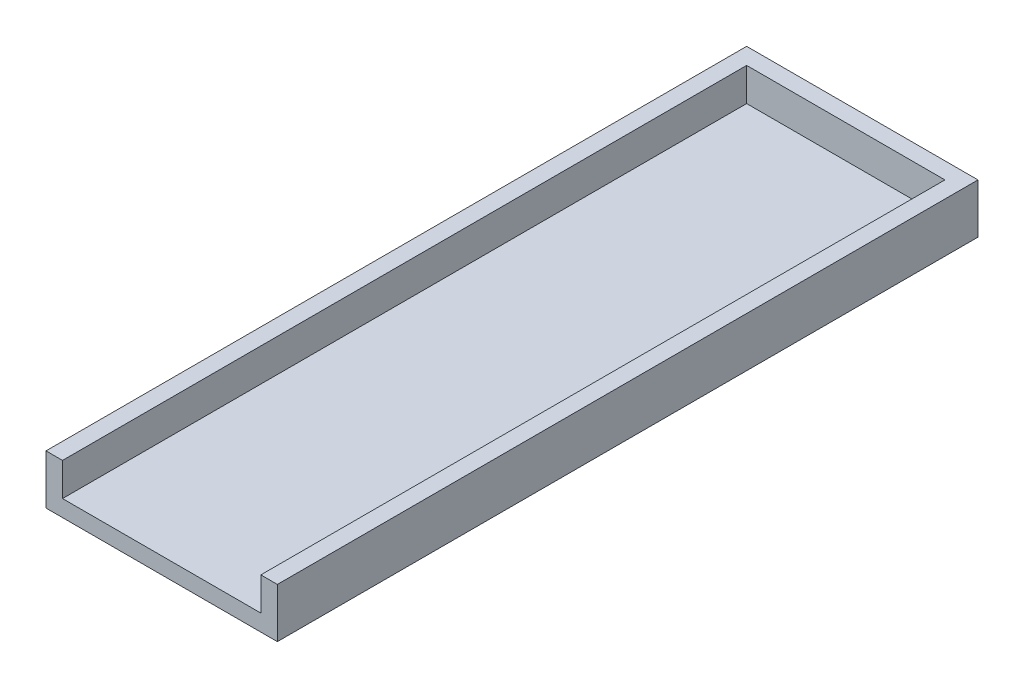
ISO-10303-21;
HEADER;
FILE_DESCRIPTION(('STEP AP214'),'2;1');
FILE_NAME('part.step','',(''),(''),'','','');
FILE_SCHEMA(('AUTOMOTIVE_DESIGN { 1 0 10303 214 1 1 1 1 }'));
ENDSEC;
DATA;
#1=APPLICATION_CONTEXT('core data for automotive mechanical design processes');
#2=APPLICATION_PROTOCOL_DEFINITION('international standard','automotive_design',2000,#1);
#3=PRODUCT_CONTEXT('',#1,'mechanical');
#4=PRODUCT('Part','Part','',(#3));
#5=PRODUCT_RELATED_PRODUCT_CATEGORY('part','',(#4));
#6=PRODUCT_DEFINITION_FORMATION('','',#4);
#7=PRODUCT_DEFINITION_CONTEXT('part definition',#1,'design');
#8=PRODUCT_DEFINITION('design','',#6,#7);
#9=PRODUCT_DEFINITION_SHAPE('','',#8);
#10=(LENGTH_UNIT() NAMED_UNIT(*) SI_UNIT(.MILLI.,.METRE.));
#11=(NAMED_UNIT(*) PLANE_ANGLE_UNIT() SI_UNIT($,.RADIAN.));
#12=(NAMED_UNIT(*) SI_UNIT($,.STERADIAN.) SOLID_ANGLE_UNIT());
#13=UNCERTAINTY_MEASURE_WITH_UNIT(LENGTH_MEASURE(1.E-05),#10,'distance_accuracy_value','');
#14=(GEOMETRIC_REPRESENTATION_CONTEXT(3) GLOBAL_UNCERTAINTY_ASSIGNED_CONTEXT((#13)) GLOBAL_UNIT_ASSIGNED_CONTEXT((#10,
#11,#12)) REPRESENTATION_CONTEXT('',''));
#15=CARTESIAN_POINT('',(0.,0.,0.));
#16=DIRECTION('',(0.,0.,1.));
#17=DIRECTION('',(1.,0.,0.));
#18=AXIS2_PLACEMENT_3D('',#15,#16,#17);
#19=CARTESIAN_POINT('',(177.8,76.2,538.48));
#20=DIRECTION('',(-1.,0.,0.));
#21=DIRECTION('',(0.,0.,1.));
#22=AXIS2_PLACEMENT_3D('',#19,#20,#21);
#23=PLANE('',#22);
#24=DIRECTION('',(0.,0.,-1.));
#25=VECTOR('',#24,1.);
#26=CARTESIAN_POINT('',(177.8,0.,538.48));
#27=LINE('',#26,#25);
#28=CARTESIAN_POINT('',(177.8,0.,538.48));
#29=VERTEX_POINT('',#28);
#30=CARTESIAN_POINT('',(177.8,0.,-538.48));
#31=VERTEX_POINT('',#30);
#32=EDGE_CURVE('E162',#29,#31,#27,.T.);
#33=ORIENTED_EDGE('',*,*,#32,.T.);
#34=DIRECTION('',(0.,-1.,0.));
#35=VECTOR('',#34,1.);
#36=CARTESIAN_POINT('',(177.8,76.2,-538.48));
#37=LINE('',#36,#35);
#38=CARTESIAN_POINT('',(177.8,76.2,-538.48));
#39=VERTEX_POINT('',#38);
#40=EDGE_CURVE('E11',#39,#31,#37,.T.);
#41=ORIENTED_EDGE('',*,*,#40,.F.);
#42=DIRECTION('',(0.,0.,-1.));
#43=VECTOR('',#42,1.);
#44=CARTESIAN_POINT('',(177.8,76.2,538.48));
#45=LINE('',#44,#43);
#46=CARTESIAN_POINT('',(177.8,76.2,538.48));
#47=VERTEX_POINT('',#46);
#48=EDGE_CURVE('E168',#47,#39,#45,.T.);
#49=ORIENTED_EDGE('',*,*,#48,.F.);
#50=DIRECTION('',(0.,-1.,0.));
#51=VECTOR('',#50,1.);
#52=CARTESIAN_POINT('',(177.8,76.2,538.48));
#53=LINE('',#52,#51);
#54=EDGE_CURVE('E179',#47,#29,#53,.T.);
#55=ORIENTED_EDGE('',*,*,#54,.T.);
#56=EDGE_LOOP('',(#33,#41,#49,#55));
#57=FACE_BOUND('',#56,.T.);
#58=ADVANCED_FACE('F45',(#57),#23,.F.);
#59=CARTESIAN_POINT('',(-177.8,76.2,-538.48));
#60=DIRECTION('',(0.,0.,1.));
#61=DIRECTION('',(1.,0.,0.));
#62=AXIS2_PLACEMENT_3D('',#59,#60,#61);
#63=PLANE('',#62);
#64=DIRECTION('',(-1.,0.,0.));
#65=VECTOR('',#64,1.);
#66=CARTESIAN_POINT('',(-177.8,0.,-538.48));
#67=LINE('',#66,#65);
#68=CARTESIAN_POINT('',(-177.8,0.,-538.48));
#69=VERTEX_POINT('',#68);
#70=EDGE_CURVE('E183',#31,#69,#67,.T.);
#71=ORIENTED_EDGE('',*,*,#70,.T.);
#72=DIRECTION('',(0.,-1.,0.));
#73=VECTOR('',#72,1.);
#74=CARTESIAN_POINT('',(-177.8,76.2,-538.48));
#75=LINE('',#74,#73);
#76=CARTESIAN_POINT('',(-177.8,76.2,-538.48));
#77=VERTEX_POINT('',#76);
#78=EDGE_CURVE('E53',#77,#69,#75,.T.);
#79=ORIENTED_EDGE('',*,*,#78,.F.);
#80=DIRECTION('',(-1.,0.,0.));
#81=VECTOR('',#80,1.);
#82=CARTESIAN_POINT('',(-177.8,76.2,-538.48));
#83=LINE('',#82,#81);
#84=EDGE_CURVE('E97',#39,#77,#83,.T.);
#85=ORIENTED_EDGE('',*,*,#84,.F.);
#86=ORIENTED_EDGE('',*,*,#40,.T.);
#87=EDGE_LOOP('',(#71,#79,#85,#86));
#88=FACE_BOUND('',#87,.T.);
#89=ADVANCED_FACE('F224',(#88),#63,.F.);
#90=CARTESIAN_POINT('',(-177.8,76.2,538.48));
#91=DIRECTION('',(1.,0.,0.));
#92=DIRECTION('',(0.,0.,-1.));
#93=AXIS2_PLACEMENT_3D('',#90,#91,#92);
#94=PLANE('',#93);
#95=DIRECTION('',(0.,0.,1.));
#96=VECTOR('',#95,1.);
#97=CARTESIAN_POINT('',(-177.8,0.,538.48));
#98=LINE('',#97,#96);
#99=CARTESIAN_POINT('',(-177.8,0.,538.48));
#100=VERTEX_POINT('',#99);
#101=EDGE_CURVE('E186',#69,#100,#98,.T.);
#102=ORIENTED_EDGE('',*,*,#101,.T.);
#103=DIRECTION('',(0.,-1.,0.));
#104=VECTOR('',#103,1.);
#105=CARTESIAN_POINT('',(-177.8,76.2,538.48));
#106=LINE('',#105,#104);
#107=CARTESIAN_POINT('',(-177.8,76.2,538.48));
#108=VERTEX_POINT('',#107);
#109=EDGE_CURVE('E193',#108,#100,#106,.T.);
#110=ORIENTED_EDGE('',*,*,#109,.F.);
#111=DIRECTION('',(0.,0.,1.));
#112=VECTOR('',#111,1.);
#113=CARTESIAN_POINT('',(-177.8,76.2,538.48));
#114=LINE('',#113,#112);
#115=EDGE_CURVE('E173',#77,#108,#114,.T.);
#116=ORIENTED_EDGE('',*,*,#115,.F.);
#117=ORIENTED_EDGE('',*,*,#78,.T.);
#118=EDGE_LOOP('',(#102,#110,#116,#117));
#119=FACE_BOUND('',#118,.T.);
#120=ADVANCED_FACE('F200',(#119),#94,.F.);
#121=CARTESIAN_POINT('',(-177.8,76.2,538.48));
#122=DIRECTION('',(0.,0.,-1.));
#123=DIRECTION('',(-1.,0.,0.));
#124=AXIS2_PLACEMENT_3D('',#121,#122,#123);
#125=PLANE('',#124);
#126=DIRECTION('',(1.,0.,0.));
#127=VECTOR('',#126,1.);
#128=CARTESIAN_POINT('',(-152.4,25.4,538.48));
#129=LINE('',#128,#127);
#130=CARTESIAN_POINT('',(-152.4,25.4,538.48));
#131=VERTEX_POINT('',#130);
#132=CARTESIAN_POINT('',(152.4,25.4,538.48));
#133=VERTEX_POINT('',#132);
#134=EDGE_CURVE('E137',#131,#133,#129,.T.);
#135=ORIENTED_EDGE('',*,*,#134,.F.);
#136=DIRECTION('',(0.,1.,0.));
#137=VECTOR('',#136,1.);
#138=CARTESIAN_POINT('',(-152.4,25.4,538.48));
#139=LINE('',#138,#137);
#140=CARTESIAN_POINT('',(-152.4,76.2,538.48));
#141=VERTEX_POINT('',#140);
#142=EDGE_CURVE('E120',#131,#141,#139,.T.);
#143=ORIENTED_EDGE('',*,*,#142,.T.);
#144=DIRECTION('',(1.,0.,0.));
#145=VECTOR('',#144,1.);
#146=CARTESIAN_POINT('',(-177.8,76.2,538.48));
#147=LINE('',#146,#145);
#148=EDGE_CURVE('E176',#108,#141,#147,.T.);
#149=ORIENTED_EDGE('',*,*,#148,.F.);
#150=ORIENTED_EDGE('',*,*,#109,.T.);
#151=DIRECTION('',(1.,0.,0.));
#152=VECTOR('',#151,1.);
#153=CARTESIAN_POINT('',(-177.8,0.,538.48));
#154=LINE('',#153,#152);
#155=EDGE_CURVE('E90',#100,#29,#154,.T.);
#156=ORIENTED_EDGE('',*,*,#155,.T.);
#157=ORIENTED_EDGE('',*,*,#54,.F.);
#158=CARTESIAN_POINT('',(152.4,76.2,538.48));
#159=VERTEX_POINT('',#158);
#160=EDGE_CURVE('E68',#159,#47,#147,.T.);
#161=ORIENTED_EDGE('',*,*,#160,.F.);
#162=DIRECTION('',(0.,1.,0.));
#163=VECTOR('',#162,1.);
#164=CARTESIAN_POINT('',(152.4,25.4,538.48));
#165=LINE('',#164,#163);
#166=EDGE_CURVE('E60',#133,#159,#165,.T.);
#167=ORIENTED_EDGE('',*,*,#166,.F.);
#168=EDGE_LOOP('',(#135,#143,#149,#150,#156,#157,#161,#167));
#169=FACE_BOUND('',#168,.T.);
#170=ADVANCED_FACE('F142',(#169),#125,.F.);
#171=CARTESIAN_POINT('',(0.,76.2,0.));
#172=DIRECTION('',(0.,-1.,0.));
#173=DIRECTION('',(0.,0.,-1.));
#174=AXIS2_PLACEMENT_3D('',#171,#172,#173);
#175=PLANE('',#174);
#176=ORIENTED_EDGE('',*,*,#148,.T.);
#177=DIRECTION('',(0.,0.,1.));
#178=VECTOR('',#177,1.);
#179=CARTESIAN_POINT('',(-152.4,76.2,538.48));
#180=LINE('',#179,#178);
#181=CARTESIAN_POINT('',(-152.4,76.2,-513.08));
#182=VERTEX_POINT('',#181);
#183=EDGE_CURVE('E126',#182,#141,#180,.T.);
#184=ORIENTED_EDGE('',*,*,#183,.F.);
#185=DIRECTION('',(-1.,0.,0.));
#186=VECTOR('',#185,1.);
#187=CARTESIAN_POINT('',(-152.4,76.2,-513.08));
#188=LINE('',#187,#186);
#189=CARTESIAN_POINT('',(152.4,76.2,-513.08));
#190=VERTEX_POINT('',#189);
#191=EDGE_CURVE('E140',#190,#182,#188,.T.);
#192=ORIENTED_EDGE('',*,*,#191,.F.);
#193=DIRECTION('',(0.,0.,-1.));
#194=VECTOR('',#193,1.);
#195=CARTESIAN_POINT('',(152.4,76.2,538.48));
#196=LINE('',#195,#194);
#197=EDGE_CURVE('E153',#159,#190,#196,.T.);
#198=ORIENTED_EDGE('',*,*,#197,.F.);
#199=ORIENTED_EDGE('',*,*,#160,.T.);
#200=ORIENTED_EDGE('',*,*,#48,.T.);
#201=ORIENTED_EDGE('',*,*,#84,.T.);
#202=ORIENTED_EDGE('',*,*,#115,.T.);
#203=EDGE_LOOP('',(#176,#184,#192,#198,#199,#200,#201,#202));
#204=FACE_BOUND('',#203,.T.);
#205=ADVANCED_FACE('F209',(#204),#175,.F.);
#206=CARTESIAN_POINT('',(0.,0.,0.));
#207=DIRECTION('',(0.,-1.,0.));
#208=DIRECTION('',(0.,0.,-1.));
#209=AXIS2_PLACEMENT_3D('',#206,#207,#208);
#210=PLANE('',#209);
#211=ORIENTED_EDGE('',*,*,#32,.F.);
#212=ORIENTED_EDGE('',*,*,#155,.F.);
#213=ORIENTED_EDGE('',*,*,#101,.F.);
#214=ORIENTED_EDGE('',*,*,#70,.F.);
#215=EDGE_LOOP('',(#211,#212,#213,#214));
#216=FACE_BOUND('',#215,.T.);
#217=ADVANCED_FACE('F204',(#216),#210,.T.);
#218=CARTESIAN_POINT('',(-152.4,25.4,538.48));
#219=DIRECTION('',(-1.,0.,0.));
#220=DIRECTION('',(0.,0.,1.));
#221=AXIS2_PLACEMENT_3D('',#218,#219,#220);
#222=PLANE('',#221);
#223=ORIENTED_EDGE('',*,*,#183,.T.);
#224=ORIENTED_EDGE('',*,*,#142,.F.);
#225=DIRECTION('',(0.,0.,1.));
#226=VECTOR('',#225,1.);
#227=CARTESIAN_POINT('',(-152.4,25.4,538.48));
#228=LINE('',#227,#226);
#229=CARTESIAN_POINT('',(-152.4,25.4,-513.08));
#230=VERTEX_POINT('',#229);
#231=EDGE_CURVE('E123',#230,#131,#228,.T.);
#232=ORIENTED_EDGE('',*,*,#231,.F.);
#233=DIRECTION('',(0.,1.,0.));
#234=VECTOR('',#233,1.);
#235=CARTESIAN_POINT('',(-152.4,25.4,-513.08));
#236=LINE('',#235,#234);
#237=EDGE_CURVE('E159',#230,#182,#236,.T.);
#238=ORIENTED_EDGE('',*,*,#237,.T.);
#239=EDGE_LOOP('',(#223,#224,#232,#238));
#240=FACE_BOUND('',#239,.T.);
#241=ADVANCED_FACE('F122',(#240),#222,.F.);
#242=CARTESIAN_POINT('',(-152.4,25.4,-513.08));
#243=DIRECTION('',(0.,0.,-1.));
#244=DIRECTION('',(-1.,0.,0.));
#245=AXIS2_PLACEMENT_3D('',#242,#243,#244);
#246=PLANE('',#245);
#247=ORIENTED_EDGE('',*,*,#191,.T.);
#248=ORIENTED_EDGE('',*,*,#237,.F.);
#249=DIRECTION('',(-1.,0.,0.));
#250=VECTOR('',#249,1.);
#251=CARTESIAN_POINT('',(-152.4,25.4,-513.08));
#252=LINE('',#251,#250);
#253=CARTESIAN_POINT('',(152.4,25.4,-513.08));
#254=VERTEX_POINT('',#253);
#255=EDGE_CURVE('E131',#254,#230,#252,.T.);
#256=ORIENTED_EDGE('',*,*,#255,.F.);
#257=DIRECTION('',(0.,1.,0.));
#258=VECTOR('',#257,1.);
#259=CARTESIAN_POINT('',(152.4,25.4,-513.08));
#260=LINE('',#259,#258);
#261=EDGE_CURVE('E163',#254,#190,#260,.T.);
#262=ORIENTED_EDGE('',*,*,#261,.T.);
#263=EDGE_LOOP('',(#247,#248,#256,#262));
#264=FACE_BOUND('',#263,.T.);
#265=ADVANCED_FACE('F212',(#264),#246,.F.);
#266=CARTESIAN_POINT('',(152.4,25.4,538.48));
#267=DIRECTION('',(1.,0.,0.));
#268=DIRECTION('',(0.,0.,-1.));
#269=AXIS2_PLACEMENT_3D('',#266,#267,#268);
#270=PLANE('',#269);
#271=ORIENTED_EDGE('',*,*,#197,.T.);
#272=ORIENTED_EDGE('',*,*,#261,.F.);
#273=DIRECTION('',(0.,0.,-1.));
#274=VECTOR('',#273,1.);
#275=CARTESIAN_POINT('',(152.4,25.4,538.48));
#276=LINE('',#275,#274);
#277=EDGE_CURVE('E144',#133,#254,#276,.T.);
#278=ORIENTED_EDGE('',*,*,#277,.F.);
#279=ORIENTED_EDGE('',*,*,#166,.T.);
#280=EDGE_LOOP('',(#271,#272,#278,#279));
#281=FACE_BOUND('',#280,.T.);
#282=ADVANCED_FACE('F213',(#281),#270,.F.);
#283=CARTESIAN_POINT('',(0.,25.4,0.));
#284=DIRECTION('',(0.,-1.,0.));
#285=DIRECTION('',(0.,0.,-1.));
#286=AXIS2_PLACEMENT_3D('',#283,#284,#285);
#287=PLANE('',#286);
#288=ORIENTED_EDGE('',*,*,#231,.T.);
#289=ORIENTED_EDGE('',*,*,#134,.T.);
#290=ORIENTED_EDGE('',*,*,#277,.T.);
#291=ORIENTED_EDGE('',*,*,#255,.T.);
#292=EDGE_LOOP('',(#288,#289,#290,#291));
#293=FACE_BOUND('',#292,.T.);
#294=ADVANCED_FACE('F135',(#293),#287,.F.);
#295=CLOSED_SHELL('',(#58,#89,#120,#170,#205,#217,#241,#265,#282,#294));
#296=MANIFOLD_SOLID_BREP('B2',#295);
#297=ADVANCED_BREP_SHAPE_REPRESENTATION('',(#18,#296),#14);
#298=SHAPE_DEFINITION_REPRESENTATION(#9,#297);
ENDSEC;
END-ISO-10303-21;
